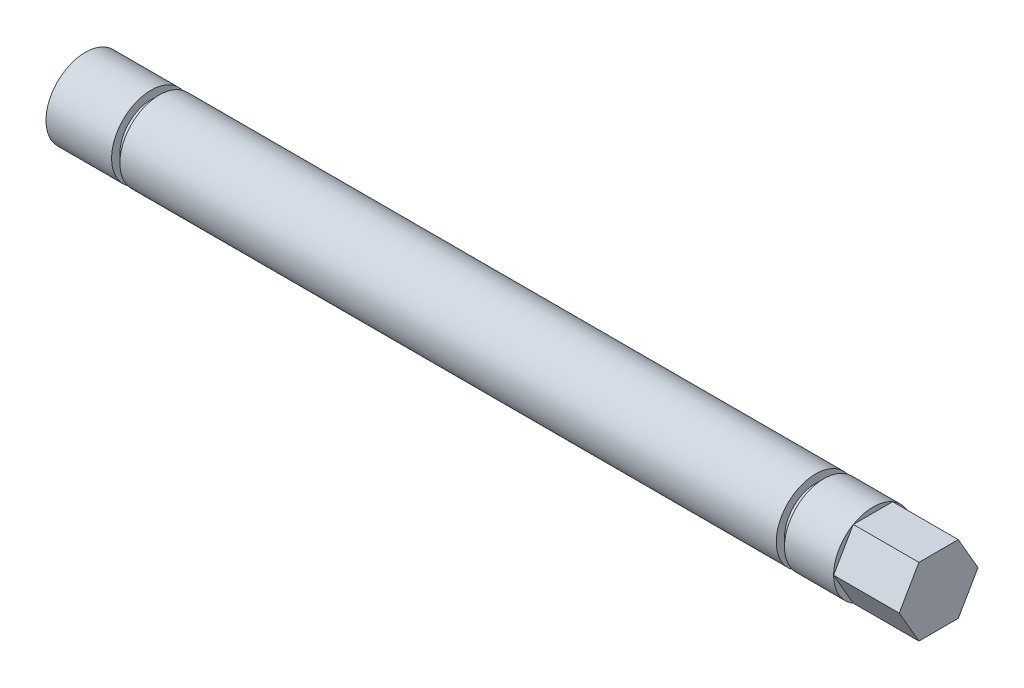
ISO-10303-21;
HEADER;
FILE_DESCRIPTION(('STEP AP214'),'2;1');
FILE_NAME('part.step','',(''),(''),'','','');
FILE_SCHEMA(('AUTOMOTIVE_DESIGN { 1 0 10303 214 1 1 1 1 }'));
ENDSEC;
DATA;
#1=APPLICATION_CONTEXT('core data for automotive mechanical design processes');
#2=APPLICATION_PROTOCOL_DEFINITION('international standard','automotive_design',2000,#1);
#3=PRODUCT_CONTEXT('',#1,'mechanical');
#4=PRODUCT('Part','Part','',(#3));
#5=PRODUCT_RELATED_PRODUCT_CATEGORY('part','',(#4));
#6=PRODUCT_DEFINITION_FORMATION('','',#4);
#7=PRODUCT_DEFINITION_CONTEXT('part definition',#1,'design');
#8=PRODUCT_DEFINITION('design','',#6,#7);
#9=PRODUCT_DEFINITION_SHAPE('','',#8);
#10=(LENGTH_UNIT() NAMED_UNIT(*) SI_UNIT(.MILLI.,.METRE.));
#11=(NAMED_UNIT(*) PLANE_ANGLE_UNIT() SI_UNIT($,.RADIAN.));
#12=(NAMED_UNIT(*) SI_UNIT($,.STERADIAN.) SOLID_ANGLE_UNIT());
#13=UNCERTAINTY_MEASURE_WITH_UNIT(LENGTH_MEASURE(1.E-05),#10,'distance_accuracy_value','');
#14=(GEOMETRIC_REPRESENTATION_CONTEXT(3) GLOBAL_UNCERTAINTY_ASSIGNED_CONTEXT((#13)) GLOBAL_UNIT_ASSIGNED_CONTEXT((#10,
#11,#12)) REPRESENTATION_CONTEXT('',''));
#15=CARTESIAN_POINT('',(0.,0.,0.));
#16=DIRECTION('',(0.,0.,1.));
#17=DIRECTION('',(1.,0.,0.));
#18=AXIS2_PLACEMENT_3D('',#15,#16,#17);
#19=CARTESIAN_POINT('',(165.1,0.,0.));
#20=DIRECTION('',(-1.,0.,0.));
#21=DIRECTION('',(0.,0.,1.));
#22=AXIS2_PLACEMENT_3D('',#19,#20,#21);
#23=CYLINDRICAL_SURFACE('',#22,7.62);
#24=CARTESIAN_POINT('',(142.9004,0.,0.));
#25=DIRECTION('',(-1.,0.,0.));
#26=DIRECTION('',(0.,-1.,0.));
#27=AXIS2_PLACEMENT_3D('',#24,#25,#26);
#28=CIRCLE('',#27,7.62);
#29=CARTESIAN_POINT('',(142.9004,-7.62,0.));
#30=VERTEX_POINT('',#29);
#31=EDGE_CURVE('E163',#30,#30,#28,.T.);
#32=ORIENTED_EDGE('',*,*,#31,.F.);
#33=EDGE_LOOP('',(#32));
#34=FACE_BOUND('',#33,.T.);
#35=CARTESIAN_POINT('',(152.4,0.,0.));
#36=DIRECTION('',(1.,0.,0.));
#37=DIRECTION('',(0.,0.,-1.));
#38=AXIS2_PLACEMENT_3D('',#35,#36,#37);
#39=CIRCLE('',#38,7.62);
#40=CARTESIAN_POINT('',(152.4,6.59911357683742,3.81));
#41=VERTEX_POINT('',#40);
#42=CARTESIAN_POINT('',(152.4,0.,7.62));
#43=VERTEX_POINT('',#42);
#44=EDGE_CURVE('E14',#41,#43,#39,.T.);
#45=ORIENTED_EDGE('',*,*,#44,.F.);
#46=CARTESIAN_POINT('',(152.4,6.59911357683743,-3.81));
#47=VERTEX_POINT('',#46);
#48=EDGE_CURVE('E56',#47,#41,#39,.T.);
#49=ORIENTED_EDGE('',*,*,#48,.F.);
#50=CARTESIAN_POINT('',(152.4,0.,-7.62000000000001));
#51=VERTEX_POINT('',#50);
#52=EDGE_CURVE('E110',#51,#47,#39,.T.);
#53=ORIENTED_EDGE('',*,*,#52,.F.);
#54=CARTESIAN_POINT('',(152.4,-6.59911357683742,-3.81000000000001));
#55=VERTEX_POINT('',#54);
#56=EDGE_CURVE('E143',#55,#51,#39,.T.);
#57=ORIENTED_EDGE('',*,*,#56,.F.);
#58=CARTESIAN_POINT('',(152.4,-6.59911357683743,3.81));
#59=VERTEX_POINT('',#58);
#60=EDGE_CURVE('E140',#59,#55,#39,.T.);
#61=ORIENTED_EDGE('',*,*,#60,.F.);
#62=EDGE_CURVE('E51',#43,#59,#39,.T.);
#63=ORIENTED_EDGE('',*,*,#62,.F.);
#64=EDGE_LOOP('',(#45,#49,#53,#57,#61,#63));
#65=FACE_BOUND('',#64,.T.);
#66=ADVANCED_FACE('F47',(#34,#65),#23,.T.);
#67=CARTESIAN_POINT('',(0.,0.,0.));
#68=DIRECTION('',(1.,0.,0.));
#69=DIRECTION('',(0.,0.,-1.));
#70=AXIS2_PLACEMENT_3D('',#67,#68,#69);
#71=CIRCLE('',#70,7.62);
#72=CARTESIAN_POINT('',(0.,0.,-7.62));
#73=VERTEX_POINT('',#72);
#74=EDGE_CURVE('E142',#73,#73,#71,.T.);
#75=ORIENTED_EDGE('',*,*,#74,.T.);
#76=EDGE_LOOP('',(#75));
#77=FACE_BOUND('',#76,.T.);
#78=CARTESIAN_POINT('',(12.7,0.,0.));
#79=DIRECTION('',(1.,0.,0.));
#80=DIRECTION('',(0.,1.,0.));
#81=AXIS2_PLACEMENT_3D('',#78,#79,#80);
#82=CIRCLE('',#81,7.62);
#83=CARTESIAN_POINT('',(12.7,7.62,0.));
#84=VERTEX_POINT('',#83);
#85=EDGE_CURVE('E145',#84,#84,#82,.T.);
#86=ORIENTED_EDGE('',*,*,#85,.F.);
#87=EDGE_LOOP('',(#86));
#88=FACE_BOUND('',#87,.T.);
#89=ADVANCED_FACE('F49',(#77,#88),#23,.T.);
#90=CARTESIAN_POINT('',(0.,0.,0.));
#91=DIRECTION('',(1.,0.,0.));
#92=DIRECTION('',(0.,0.,-1.));
#93=AXIS2_PLACEMENT_3D('',#90,#91,#92);
#94=PLANE('',#93);
#95=ORIENTED_EDGE('',*,*,#74,.F.);
#96=EDGE_LOOP('',(#95));
#97=FACE_BOUND('',#96,.T.);
#98=ADVANCED_FACE('F225',(#97),#94,.F.);
#99=CARTESIAN_POINT('',(12.7,6.0198,0.));
#100=DIRECTION('',(1.,0.,0.));
#101=DIRECTION('',(0.,1.,0.));
#102=AXIS2_PLACEMENT_3D('',#99,#100,#101);
#103=PLANE('',#102);
#104=CARTESIAN_POINT('',(12.7,0.,0.));
#105=DIRECTION('',(-1.,0.,0.));
#106=DIRECTION('',(0.,-1.,0.));
#107=AXIS2_PLACEMENT_3D('',#104,#105,#106);
#108=CIRCLE('',#107,6.0198);
#109=CARTESIAN_POINT('',(12.7,-6.0198,0.));
#110=VERTEX_POINT('',#109);
#111=EDGE_CURVE('E153',#110,#110,#108,.T.);
#112=ORIENTED_EDGE('',*,*,#111,.T.);
#113=EDGE_LOOP('',(#112));
#114=FACE_BOUND('',#113,.T.);
#115=ORIENTED_EDGE('',*,*,#85,.T.);
#116=EDGE_LOOP('',(#115));
#117=FACE_BOUND('',#116,.T.);
#118=ADVANCED_FACE('F253',(#114,#117),#103,.T.);
#119=CARTESIAN_POINT('',(14.3002,6.01980000000001,0.));
#120=DIRECTION('',(-1.,0.,0.));
#121=DIRECTION('',(0.,-1.,0.));
#122=AXIS2_PLACEMENT_3D('',#119,#120,#121);
#123=PLANE('',#122);
#124=CARTESIAN_POINT('',(14.3002,0.,0.));
#125=DIRECTION('',(-1.,0.,0.));
#126=DIRECTION('',(0.,-1.,0.));
#127=AXIS2_PLACEMENT_3D('',#124,#125,#126);
#128=CIRCLE('',#127,6.01980000000001);
#129=CARTESIAN_POINT('',(14.3002,-6.01980000000001,0.));
#130=VERTEX_POINT('',#129);
#131=EDGE_CURVE('E159',#130,#130,#128,.T.);
#132=ORIENTED_EDGE('',*,*,#131,.F.);
#133=EDGE_LOOP('',(#132));
#134=FACE_BOUND('',#133,.T.);
#135=CARTESIAN_POINT('',(14.3002,0.,0.));
#136=DIRECTION('',(-1.,0.,0.));
#137=DIRECTION('',(0.,-1.,0.));
#138=AXIS2_PLACEMENT_3D('',#135,#136,#137);
#139=CIRCLE('',#138,7.62);
#140=CARTESIAN_POINT('',(14.3002,-7.62,0.));
#141=VERTEX_POINT('',#140);
#142=EDGE_CURVE('E150',#141,#141,#139,.T.);
#143=ORIENTED_EDGE('',*,*,#142,.T.);
#144=EDGE_LOOP('',(#143));
#145=FACE_BOUND('',#144,.T.);
#146=ADVANCED_FACE('F238',(#134,#145),#123,.T.);
#147=CARTESIAN_POINT('',(0.,0.,0.));
#148=DIRECTION('',(-1.,0.,0.));
#149=DIRECTION('',(0.,-1.,0.));
#150=AXIS2_PLACEMENT_3D('',#147,#148,#149);
#151=CYLINDRICAL_SURFACE('',#150,6.01980000000001);
#152=ORIENTED_EDGE('',*,*,#131,.T.);
#153=EDGE_LOOP('',(#152));
#154=FACE_BOUND('',#153,.T.);
#155=ORIENTED_EDGE('',*,*,#111,.F.);
#156=EDGE_LOOP('',(#155));
#157=FACE_BOUND('',#156,.T.);
#158=ADVANCED_FACE('F229',(#154,#157),#151,.T.);
#159=CARTESIAN_POINT('',(141.3002,0.,0.));
#160=DIRECTION('',(-1.,0.,0.));
#161=DIRECTION('',(0.,-1.,0.));
#162=AXIS2_PLACEMENT_3D('',#159,#160,#161);
#163=CIRCLE('',#162,7.62);
#164=CARTESIAN_POINT('',(141.3002,-7.62,0.));
#165=VERTEX_POINT('',#164);
#166=EDGE_CURVE('E167',#165,#165,#163,.T.);
#167=ORIENTED_EDGE('',*,*,#166,.T.);
#168=EDGE_LOOP('',(#167));
#169=FACE_BOUND('',#168,.T.);
#170=ORIENTED_EDGE('',*,*,#142,.F.);
#171=EDGE_LOOP('',(#170));
#172=FACE_BOUND('',#171,.T.);
#173=ADVANCED_FACE('F221',(#169,#172),#23,.T.);
#174=CARTESIAN_POINT('',(142.9004,0.,0.));
#175=DIRECTION('',(-1.,0.,0.));
#176=DIRECTION('',(0.,-1.,0.));
#177=AXIS2_PLACEMENT_3D('',#174,#175,#176);
#178=PLANE('',#177);
#179=CARTESIAN_POINT('',(142.9004,0.,0.));
#180=DIRECTION('',(-1.,0.,0.));
#181=DIRECTION('',(0.,-1.,0.));
#182=AXIS2_PLACEMENT_3D('',#179,#180,#181);
#183=CIRCLE('',#182,6.0198);
#184=CARTESIAN_POINT('',(142.9004,-6.01980000000001,0.));
#185=VERTEX_POINT('',#184);
#186=EDGE_CURVE('E171',#185,#185,#183,.T.);
#187=ORIENTED_EDGE('',*,*,#186,.F.);
#188=EDGE_LOOP('',(#187));
#189=FACE_BOUND('',#188,.T.);
#190=ORIENTED_EDGE('',*,*,#31,.T.);
#191=EDGE_LOOP('',(#190));
#192=FACE_BOUND('',#191,.T.);
#193=ADVANCED_FACE('F228',(#189,#192),#178,.T.);
#194=CARTESIAN_POINT('',(141.3002,0.,0.));
#195=DIRECTION('',(-1.,0.,0.));
#196=DIRECTION('',(0.,-1.,0.));
#197=AXIS2_PLACEMENT_3D('',#194,#195,#196);
#198=PLANE('',#197);
#199=CARTESIAN_POINT('',(141.3002,0.,0.));
#200=DIRECTION('',(-1.,0.,0.));
#201=DIRECTION('',(0.,-1.,0.));
#202=AXIS2_PLACEMENT_3D('',#199,#200,#201);
#203=CIRCLE('',#202,6.0198);
#204=CARTESIAN_POINT('',(141.3002,-6.01980000000001,0.));
#205=VERTEX_POINT('',#204);
#206=EDGE_CURVE('E173',#205,#205,#203,.T.);
#207=ORIENTED_EDGE('',*,*,#206,.T.);
#208=EDGE_LOOP('',(#207));
#209=FACE_BOUND('',#208,.T.);
#210=ORIENTED_EDGE('',*,*,#166,.F.);
#211=EDGE_LOOP('',(#210));
#212=FACE_BOUND('',#211,.T.);
#213=ADVANCED_FACE('F235',(#209,#212),#198,.F.);
#214=CARTESIAN_POINT('',(142.9004,0.,0.));
#215=DIRECTION('',(-1.,0.,0.));
#216=DIRECTION('',(0.,-1.,0.));
#217=AXIS2_PLACEMENT_3D('',#214,#215,#216);
#218=CYLINDRICAL_SURFACE('',#217,6.0198);
#219=ORIENTED_EDGE('',*,*,#186,.T.);
#220=EDGE_LOOP('',(#219));
#221=FACE_BOUND('',#220,.T.);
#222=ORIENTED_EDGE('',*,*,#206,.F.);
#223=EDGE_LOOP('',(#222));
#224=FACE_BOUND('',#223,.T.);
#225=ADVANCED_FACE('F244',(#221,#224),#218,.T.);
#226=CARTESIAN_POINT('',(152.4,0.,0.));
#227=DIRECTION('',(1.,0.,0.));
#228=DIRECTION('',(0.,0.,-1.));
#229=AXIS2_PLACEMENT_3D('',#226,#227,#228);
#230=PLANE('',#229);
#231=ORIENTED_EDGE('',*,*,#52,.T.);
#232=DIRECTION('',(0.,0.866025403784438,0.5));
#233=VECTOR('',#232,1.);
#234=CARTESIAN_POINT('',(152.4,0.,-7.62000000000001));
#235=LINE('',#234,#233);
#236=EDGE_CURVE('E125',#51,#47,#235,.T.);
#237=ORIENTED_EDGE('',*,*,#236,.F.);
#238=EDGE_LOOP('',(#231,#237));
#239=FACE_BOUND('',#238,.T.);
#240=ADVANCED_FACE('F216',(#239),#230,.T.);
#241=ORIENTED_EDGE('',*,*,#48,.T.);
#242=DIRECTION('',(0.,0.,1.));
#243=VECTOR('',#242,1.);
#244=CARTESIAN_POINT('',(152.4,6.59911357683743,-3.81));
#245=LINE('',#244,#243);
#246=EDGE_CURVE('E105',#47,#41,#245,.T.);
#247=ORIENTED_EDGE('',*,*,#246,.F.);
#248=EDGE_LOOP('',(#241,#247));
#249=FACE_BOUND('',#248,.T.);
#250=ADVANCED_FACE('F103',(#249),#230,.T.);
#251=ORIENTED_EDGE('',*,*,#44,.T.);
#252=DIRECTION('',(0.,-0.866025403784439,0.5));
#253=VECTOR('',#252,1.);
#254=CARTESIAN_POINT('',(152.4,6.59911357683742,3.81));
#255=LINE('',#254,#253);
#256=EDGE_CURVE('E117',#41,#43,#255,.T.);
#257=ORIENTED_EDGE('',*,*,#256,.F.);
#258=EDGE_LOOP('',(#251,#257));
#259=FACE_BOUND('',#258,.T.);
#260=ADVANCED_FACE('F128',(#259),#230,.T.);
#261=ORIENTED_EDGE('',*,*,#62,.T.);
#262=DIRECTION('',(0.,-0.866025403784438,-0.5));
#263=VECTOR('',#262,1.);
#264=CARTESIAN_POINT('',(152.4,0.,7.62));
#265=LINE('',#264,#263);
#266=EDGE_CURVE('E130',#43,#59,#265,.T.);
#267=ORIENTED_EDGE('',*,*,#266,.F.);
#268=EDGE_LOOP('',(#261,#267));
#269=FACE_BOUND('',#268,.T.);
#270=ADVANCED_FACE('F206',(#269),#230,.T.);
#271=ORIENTED_EDGE('',*,*,#60,.T.);
#272=DIRECTION('',(0.,0.,-1.));
#273=VECTOR('',#272,1.);
#274=CARTESIAN_POINT('',(152.4,-6.59911357683743,3.81));
#275=LINE('',#274,#273);
#276=EDGE_CURVE('E63',#59,#55,#275,.T.);
#277=ORIENTED_EDGE('',*,*,#276,.F.);
#278=EDGE_LOOP('',(#271,#277));
#279=FACE_BOUND('',#278,.T.);
#280=ADVANCED_FACE('F208',(#279),#230,.T.);
#281=ORIENTED_EDGE('',*,*,#56,.T.);
#282=DIRECTION('',(0.,0.866025403784439,-0.5));
#283=VECTOR('',#282,1.);
#284=CARTESIAN_POINT('',(152.4,-6.59911357683742,-3.81000000000001));
#285=LINE('',#284,#283);
#286=EDGE_CURVE('E199',#55,#51,#285,.T.);
#287=ORIENTED_EDGE('',*,*,#286,.F.);
#288=EDGE_LOOP('',(#281,#287));
#289=FACE_BOUND('',#288,.T.);
#290=ADVANCED_FACE('F214',(#289),#230,.T.);
#291=CARTESIAN_POINT('',(152.4,6.59911357683743,-3.81));
#292=DIRECTION('',(0.,1.,0.));
#293=DIRECTION('',(0.,0.,1.));
#294=AXIS2_PLACEMENT_3D('',#291,#292,#293);
#295=PLANE('',#294);
#296=DIRECTION('',(0.,0.,1.));
#297=VECTOR('',#296,1.);
#298=CARTESIAN_POINT('',(165.1,6.59911357683743,-3.81));
#299=LINE('',#298,#297);
#300=CARTESIAN_POINT('',(165.1,6.59911357683743,-3.81));
#301=VERTEX_POINT('',#300);
#302=CARTESIAN_POINT('',(165.1,6.59911357683742,3.81));
#303=VERTEX_POINT('',#302);
#304=EDGE_CURVE('E196',#301,#303,#299,.T.);
#305=ORIENTED_EDGE('',*,*,#304,.F.);
#306=DIRECTION('',(1.,0.,0.));
#307=VECTOR('',#306,1.);
#308=CARTESIAN_POINT('',(152.4,6.59911357683743,-3.81));
#309=LINE('',#308,#307);
#310=EDGE_CURVE('E134',#47,#301,#309,.T.);
#311=ORIENTED_EDGE('',*,*,#310,.F.);
#312=ORIENTED_EDGE('',*,*,#246,.T.);
#313=DIRECTION('',(1.,0.,0.));
#314=VECTOR('',#313,1.);
#315=CARTESIAN_POINT('',(152.4,6.59911357683742,3.81));
#316=LINE('',#315,#314);
#317=EDGE_CURVE('E114',#41,#303,#316,.T.);
#318=ORIENTED_EDGE('',*,*,#317,.T.);
#319=EDGE_LOOP('',(#305,#311,#312,#318));
#320=FACE_BOUND('',#319,.T.);
#321=ADVANCED_FACE('F133',(#320),#295,.T.);
#322=CARTESIAN_POINT('',(152.4,0.,-7.62000000000001));
#323=DIRECTION('',(0.,0.5,-0.866025403784439));
#324=DIRECTION('',(0.,0.866025403784439,0.5));
#325=AXIS2_PLACEMENT_3D('',#322,#323,#324);
#326=PLANE('',#325);
#327=DIRECTION('',(0.,0.866025403784438,0.5));
#328=VECTOR('',#327,1.);
#329=CARTESIAN_POINT('',(165.1,0.,-7.62000000000001));
#330=LINE('',#329,#328);
#331=CARTESIAN_POINT('',(165.1,0.,-7.62000000000001));
#332=VERTEX_POINT('',#331);
#333=EDGE_CURVE('E135',#332,#301,#330,.T.);
#334=ORIENTED_EDGE('',*,*,#333,.F.);
#335=DIRECTION('',(1.,0.,0.));
#336=VECTOR('',#335,1.);
#337=CARTESIAN_POINT('',(152.4,0.,-7.62000000000001));
#338=LINE('',#337,#336);
#339=EDGE_CURVE('E183',#51,#332,#338,.T.);
#340=ORIENTED_EDGE('',*,*,#339,.F.);
#341=ORIENTED_EDGE('',*,*,#236,.T.);
#342=ORIENTED_EDGE('',*,*,#310,.T.);
#343=EDGE_LOOP('',(#334,#340,#341,#342));
#344=FACE_BOUND('',#343,.T.);
#345=ADVANCED_FACE('F330',(#344),#326,.T.);
#346=CARTESIAN_POINT('',(152.4,-6.59911357683742,-3.81000000000001));
#347=DIRECTION('',(0.,-0.5,-0.866025403784439));
#348=DIRECTION('',(0.,0.866025403784439,-0.5));
#349=AXIS2_PLACEMENT_3D('',#346,#347,#348);
#350=PLANE('',#349);
#351=DIRECTION('',(0.,0.866025403784439,-0.5));
#352=VECTOR('',#351,1.);
#353=CARTESIAN_POINT('',(165.1,-6.59911357683742,-3.81000000000001));
#354=LINE('',#353,#352);
#355=CARTESIAN_POINT('',(165.1,-6.59911357683742,-3.81000000000001));
#356=VERTEX_POINT('',#355);
#357=EDGE_CURVE('E188',#356,#332,#354,.T.);
#358=ORIENTED_EDGE('',*,*,#357,.F.);
#359=DIRECTION('',(1.,0.,0.));
#360=VECTOR('',#359,1.);
#361=CARTESIAN_POINT('',(152.4,-6.59911357683742,-3.81000000000001));
#362=LINE('',#361,#360);
#363=EDGE_CURVE('E181',#55,#356,#362,.T.);
#364=ORIENTED_EDGE('',*,*,#363,.F.);
#365=ORIENTED_EDGE('',*,*,#286,.T.);
#366=ORIENTED_EDGE('',*,*,#339,.T.);
#367=EDGE_LOOP('',(#358,#364,#365,#366));
#368=FACE_BOUND('',#367,.T.);
#369=ADVANCED_FACE('F336',(#368),#350,.T.);
#370=CARTESIAN_POINT('',(152.4,-6.59911357683743,3.81));
#371=DIRECTION('',(0.,-1.,0.));
#372=DIRECTION('',(0.,0.,-1.));
#373=AXIS2_PLACEMENT_3D('',#370,#371,#372);
#374=PLANE('',#373);
#375=DIRECTION('',(0.,0.,-1.));
#376=VECTOR('',#375,1.);
#377=CARTESIAN_POINT('',(165.1,-6.59911357683743,3.81));
#378=LINE('',#377,#376);
#379=CARTESIAN_POINT('',(165.1,-6.59911357683743,3.81));
#380=VERTEX_POINT('',#379);
#381=EDGE_CURVE('E191',#380,#356,#378,.T.);
#382=ORIENTED_EDGE('',*,*,#381,.F.);
#383=DIRECTION('',(1.,0.,0.));
#384=VECTOR('',#383,1.);
#385=CARTESIAN_POINT('',(152.4,-6.59911357683743,3.81));
#386=LINE('',#385,#384);
#387=EDGE_CURVE('E179',#59,#380,#386,.T.);
#388=ORIENTED_EDGE('',*,*,#387,.F.);
#389=ORIENTED_EDGE('',*,*,#276,.T.);
#390=ORIENTED_EDGE('',*,*,#363,.T.);
#391=EDGE_LOOP('',(#382,#388,#389,#390));
#392=FACE_BOUND('',#391,.T.);
#393=ADVANCED_FACE('F344',(#392),#374,.T.);
#394=CARTESIAN_POINT('',(152.4,0.,7.62));
#395=DIRECTION('',(0.,-0.5,0.866025403784438));
#396=DIRECTION('',(0.,-0.866025403784438,-0.500000000000001));
#397=AXIS2_PLACEMENT_3D('',#394,#395,#396);
#398=PLANE('',#397);
#399=DIRECTION('',(0.,-0.866025403784438,-0.5));
#400=VECTOR('',#399,1.);
#401=CARTESIAN_POINT('',(165.1,0.,7.62));
#402=LINE('',#401,#400);
#403=CARTESIAN_POINT('',(165.1,0.,7.62));
#404=VERTEX_POINT('',#403);
#405=EDGE_CURVE('E71',#404,#380,#402,.T.);
#406=ORIENTED_EDGE('',*,*,#405,.F.);
#407=DIRECTION('',(1.,0.,0.));
#408=VECTOR('',#407,1.);
#409=CARTESIAN_POINT('',(152.4,0.,7.62));
#410=LINE('',#409,#408);
#411=EDGE_CURVE('E124',#43,#404,#410,.T.);
#412=ORIENTED_EDGE('',*,*,#411,.F.);
#413=ORIENTED_EDGE('',*,*,#266,.T.);
#414=ORIENTED_EDGE('',*,*,#387,.T.);
#415=EDGE_LOOP('',(#406,#412,#413,#414));
#416=FACE_BOUND('',#415,.T.);
#417=ADVANCED_FACE('F204',(#416),#398,.T.);
#418=CARTESIAN_POINT('',(152.4,6.59911357683742,3.81));
#419=DIRECTION('',(0.,0.5,0.866025403784439));
#420=DIRECTION('',(0.,-0.866025403784439,0.5));
#421=AXIS2_PLACEMENT_3D('',#418,#419,#420);
#422=PLANE('',#421);
#423=DIRECTION('',(0.,-0.866025403784439,0.5));
#424=VECTOR('',#423,1.);
#425=CARTESIAN_POINT('',(165.1,6.59911357683742,3.81));
#426=LINE('',#425,#424);
#427=EDGE_CURVE('E120',#303,#404,#426,.T.);
#428=ORIENTED_EDGE('',*,*,#427,.F.);
#429=ORIENTED_EDGE('',*,*,#317,.F.);
#430=ORIENTED_EDGE('',*,*,#256,.T.);
#431=ORIENTED_EDGE('',*,*,#411,.T.);
#432=EDGE_LOOP('',(#428,#429,#430,#431));
#433=FACE_BOUND('',#432,.T.);
#434=ADVANCED_FACE('F116',(#433),#422,.T.);
#435=CARTESIAN_POINT('',(165.1,0.,0.));
#436=DIRECTION('',(1.,0.,0.));
#437=DIRECTION('',(0.,0.,-1.));
#438=AXIS2_PLACEMENT_3D('',#435,#436,#437);
#439=PLANE('',#438);
#440=ORIENTED_EDGE('',*,*,#333,.T.);
#441=ORIENTED_EDGE('',*,*,#304,.T.);
#442=ORIENTED_EDGE('',*,*,#427,.T.);
#443=ORIENTED_EDGE('',*,*,#405,.T.);
#444=ORIENTED_EDGE('',*,*,#381,.T.);
#445=ORIENTED_EDGE('',*,*,#357,.T.);
#446=EDGE_LOOP('',(#440,#441,#442,#443,#444,#445));
#447=FACE_BOUND('',#446,.T.);
#448=ADVANCED_FACE('F258',(#447),#439,.T.);
#449=CLOSED_SHELL('',(#66,#89,#98,#118,#146,#158,#173,#193,#213,#225,#240,#250,#260,#270,#280,
#290,#321,#345,#369,#393,#417,#434,#448));
#450=MANIFOLD_SOLID_BREP('B2',#449);
#451=ADVANCED_BREP_SHAPE_REPRESENTATION('',(#18,#450),#14);
#452=SHAPE_DEFINITION_REPRESENTATION(#9,#451);
ENDSEC;
END-ISO-10303-21;
